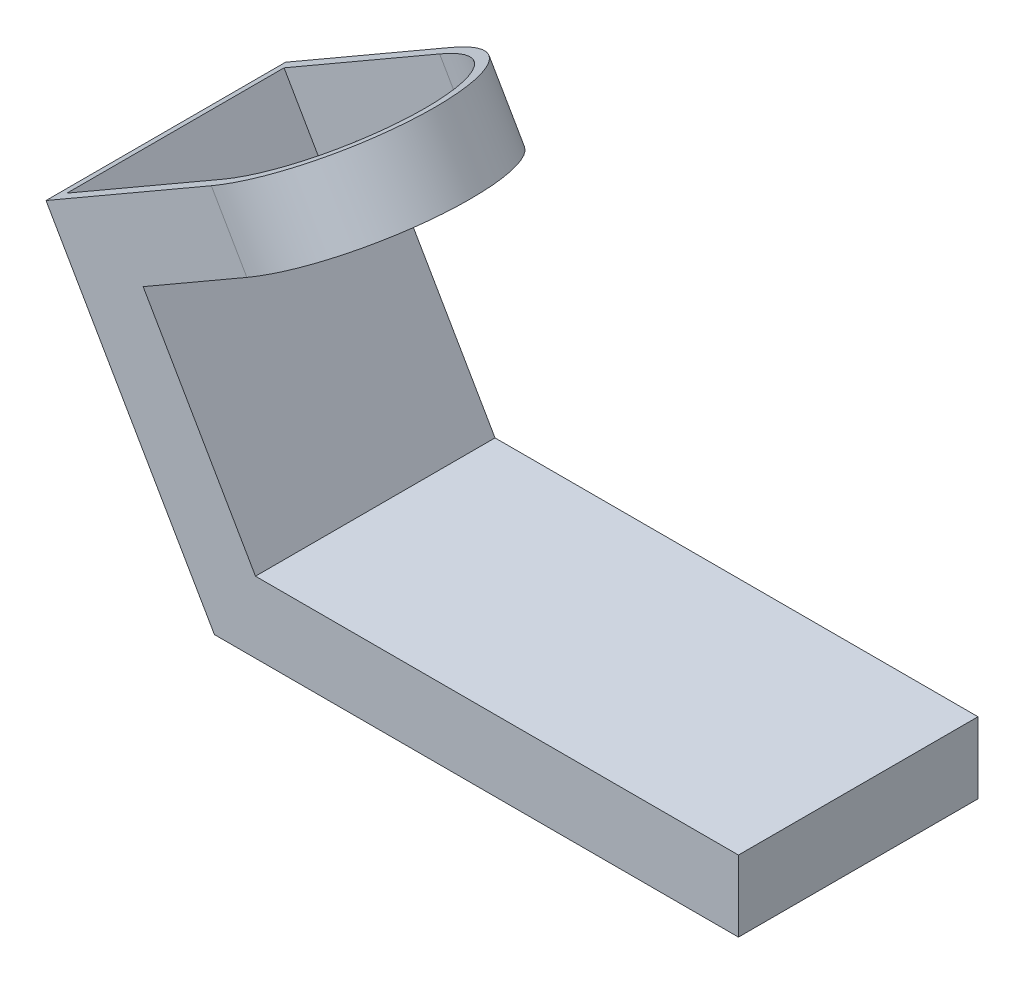
ISO-10303-21;
HEADER;
FILE_DESCRIPTION(('STEP AP214'),'2;1');
FILE_NAME('part.step','',(''),(''),'','','');
FILE_SCHEMA(('AUTOMOTIVE_DESIGN { 1 0 10303 214 1 1 1 1 }'));
ENDSEC;
DATA;
#1=APPLICATION_CONTEXT('core data for automotive mechanical design processes');
#2=APPLICATION_PROTOCOL_DEFINITION('international standard','automotive_design',2000,#1);
#3=PRODUCT_CONTEXT('',#1,'mechanical');
#4=PRODUCT('Part','Part','',(#3));
#5=PRODUCT_RELATED_PRODUCT_CATEGORY('part','',(#4));
#6=PRODUCT_DEFINITION_FORMATION('','',#4);
#7=PRODUCT_DEFINITION_CONTEXT('part definition',#1,'design');
#8=PRODUCT_DEFINITION('design','',#6,#7);
#9=PRODUCT_DEFINITION_SHAPE('','',#8);
#10=(LENGTH_UNIT() NAMED_UNIT(*) SI_UNIT(.MILLI.,.METRE.));
#11=(NAMED_UNIT(*) PLANE_ANGLE_UNIT() SI_UNIT($,.RADIAN.));
#12=(NAMED_UNIT(*) SI_UNIT($,.STERADIAN.) SOLID_ANGLE_UNIT());
#13=UNCERTAINTY_MEASURE_WITH_UNIT(LENGTH_MEASURE(1.E-05),#10,'distance_accuracy_value','');
#14=(GEOMETRIC_REPRESENTATION_CONTEXT(3) GLOBAL_UNCERTAINTY_ASSIGNED_CONTEXT((#13)) GLOBAL_UNIT_ASSIGNED_CONTEXT((#10,
#11,#12)) REPRESENTATION_CONTEXT('',''));
#15=CARTESIAN_POINT('',(0.,0.,0.));
#16=DIRECTION('',(0.,0.,1.));
#17=DIRECTION('',(1.,0.,0.));
#18=AXIS2_PLACEMENT_3D('',#15,#16,#17);
#19=CARTESIAN_POINT('',(-44.9999999999998,77.9422863405996,-64.));
#20=DIRECTION('',(-0.499999999999998,0.86602540378444,0.));
#21=DIRECTION('',(-0.86602540378444,-0.499999999999998,0.));
#22=AXIS2_PLACEMENT_3D('',#19,#20,#21);
#23=PLANE('',#22);
#24=DIRECTION('',(-0.86602540378444,-0.499999999999998,0.));
#25=VECTOR('',#24,1.);
#26=CARTESIAN_POINT('',(-44.9999999999998,77.9422863405996,0.));
#27=LINE('',#26,#25);
#28=CARTESIAN_POINT('',(-0.832704406993401,103.442286340599,0.));
#29=VERTEX_POINT('',#28);
#30=CARTESIAN_POINT('',(-44.9999999999998,77.9422863405996,0.));
#31=VERTEX_POINT('',#30);
#32=EDGE_CURVE('E184',#29,#31,#27,.T.);
#33=ORIENTED_EDGE('',*,*,#32,.F.);
#34=CARTESIAN_POINT('',(-0.832704406993429,103.442286340599,-32.));
#35=DIRECTION('',(-0.499999999999998,0.86602540378444,0.));
#36=DIRECTION('',(0.86602540378444,0.499999999999998,0.));
#37=AXIS2_PLACEMENT_3D('',#34,#35,#36);
#38=CIRCLE('',#37,32.);
#39=CARTESIAN_POINT('',(-0.832704406993429,103.442286340599,-64.));
#40=VERTEX_POINT('',#39);
#41=EDGE_CURVE('E209',#29,#40,#38,.T.);
#42=ORIENTED_EDGE('',*,*,#41,.T.);
#43=DIRECTION('',(-0.86602540378444,-0.499999999999998,0.));
#44=VECTOR('',#43,1.);
#45=CARTESIAN_POINT('',(-44.9999999999998,77.9422863405996,-64.));
#46=LINE('',#45,#44);
#47=CARTESIAN_POINT('',(-44.9999999999998,77.9422863405996,-64.));
#48=VERTEX_POINT('',#47);
#49=EDGE_CURVE('E155',#40,#48,#46,.T.);
#50=ORIENTED_EDGE('',*,*,#49,.T.);
#51=DIRECTION('',(0.,0.,1.));
#52=VECTOR('',#51,1.);
#53=CARTESIAN_POINT('',(-44.9999999999998,77.9422863405996,-64.));
#54=LINE('',#53,#52);
#55=EDGE_CURVE('E53',#48,#31,#54,.T.);
#56=ORIENTED_EDGE('',*,*,#55,.T.);
#57=EDGE_LOOP('',(#33,#42,#50,#56));
#58=FACE_BOUND('',#57,.T.);
#59=CARTESIAN_POINT('',(-0.832704406993418,103.442286340599,-32.));
#60=DIRECTION('',(-0.499999999999998,0.86602540378444,0.));
#61=DIRECTION('',(-0.86602540378444,-0.499999999999998,0.));
#62=AXIS2_PLACEMENT_3D('',#59,#60,#61);
#63=CIRCLE('',#62,29.);
#64=CARTESIAN_POINT('',(-0.832704406993405,103.442286340599,-2.99999999999999));
#65=VERTEX_POINT('',#64);
#66=CARTESIAN_POINT('',(-0.832704406993427,103.442286340599,-61.));
#67=VERTEX_POINT('',#66);
#68=EDGE_CURVE('E228',#65,#67,#63,.T.);
#69=ORIENTED_EDGE('',*,*,#68,.F.);
#70=DIRECTION('',(-0.86602540378444,-0.499999999999998,0.));
#71=VECTOR('',#70,1.);
#72=CARTESIAN_POINT('',(-44.9999999999998,77.9422863405996,-3.));
#73=LINE('',#72,#71);
#74=CARTESIAN_POINT('',(-42.4019237886465,79.4422863405996,-3.));
#75=VERTEX_POINT('',#74);
#76=EDGE_CURVE('E237',#65,#75,#73,.T.);
#77=ORIENTED_EDGE('',*,*,#76,.T.);
#78=DIRECTION('',(0.,0.,1.));
#79=VECTOR('',#78,1.);
#80=CARTESIAN_POINT('',(-42.4019237886465,79.4422863405996,-64.));
#81=LINE('',#80,#79);
#82=CARTESIAN_POINT('',(-42.4019237886465,79.4422863405996,-61.));
#83=VERTEX_POINT('',#82);
#84=EDGE_CURVE('E243',#83,#75,#81,.T.);
#85=ORIENTED_EDGE('',*,*,#84,.F.);
#86=DIRECTION('',(-0.86602540378444,-0.499999999999998,0.));
#87=VECTOR('',#86,1.);
#88=CARTESIAN_POINT('',(-44.9999999999998,77.9422863405996,-61.));
#89=LINE('',#88,#87);
#90=EDGE_CURVE('E229',#67,#83,#89,.T.);
#91=ORIENTED_EDGE('',*,*,#90,.F.);
#92=EDGE_LOOP('',(#69,#77,#85,#91));
#93=FACE_BOUND('',#92,.T.);
#94=ADVANCED_FACE('F43',(#58,#93),#23,.T.);
#95=CARTESIAN_POINT('',(140.,0.,-64.));
#96=DIRECTION('',(0.,-1.,0.));
#97=DIRECTION('',(0.,0.,-1.));
#98=AXIS2_PLACEMENT_3D('',#95,#96,#97);
#99=PLANE('',#98);
#100=DIRECTION('',(1.,0.,0.));
#101=VECTOR('',#100,1.);
#102=CARTESIAN_POINT('',(140.,0.,0.));
#103=LINE('',#102,#101);
#104=CARTESIAN_POINT('',(0.,0.,0.));
#105=VERTEX_POINT('',#104);
#106=CARTESIAN_POINT('',(140.,0.,0.));
#107=VERTEX_POINT('',#106);
#108=EDGE_CURVE('E162',#105,#107,#103,.T.);
#109=ORIENTED_EDGE('',*,*,#108,.F.);
#110=DIRECTION('',(0.,0.,1.));
#111=VECTOR('',#110,1.);
#112=CARTESIAN_POINT('',(0.,0.,-64.));
#113=LINE('',#112,#111);
#114=CARTESIAN_POINT('',(0.,0.,-64.));
#115=VERTEX_POINT('',#114);
#116=EDGE_CURVE('E11',#115,#105,#113,.T.);
#117=ORIENTED_EDGE('',*,*,#116,.F.);
#118=DIRECTION('',(1.,0.,0.));
#119=VECTOR('',#118,1.);
#120=CARTESIAN_POINT('',(140.,0.,-64.));
#121=LINE('',#120,#119);
#122=CARTESIAN_POINT('',(140.,0.,-64.));
#123=VERTEX_POINT('',#122);
#124=EDGE_CURVE('E191',#115,#123,#121,.T.);
#125=ORIENTED_EDGE('',*,*,#124,.T.);
#126=DIRECTION('',(0.,0.,1.));
#127=VECTOR('',#126,1.);
#128=CARTESIAN_POINT('',(140.,0.,-64.));
#129=LINE('',#128,#127);
#130=EDGE_CURVE('E47',#123,#107,#129,.T.);
#131=ORIENTED_EDGE('',*,*,#130,.T.);
#132=EDGE_LOOP('',(#109,#117,#125,#131));
#133=FACE_BOUND('',#132,.T.);
#134=ADVANCED_FACE('F45',(#133),#99,.T.);
#135=CARTESIAN_POINT('',(0.,0.,-64.));
#136=DIRECTION('',(-0.86602540378444,-0.499999999999998,0.));
#137=DIRECTION('',(0.499999999999998,-0.86602540378444,0.));
#138=AXIS2_PLACEMENT_3D('',#135,#136,#137);
#139=PLANE('',#138);
#140=DIRECTION('',(0.499999999999998,-0.86602540378444,0.));
#141=VECTOR('',#140,1.);
#142=CARTESIAN_POINT('',(0.,0.,0.));
#143=LINE('',#142,#141);
#144=EDGE_CURVE('E188',#31,#105,#143,.T.);
#145=ORIENTED_EDGE('',*,*,#144,.F.);
#146=ORIENTED_EDGE('',*,*,#55,.F.);
#147=DIRECTION('',(0.499999999999998,-0.86602540378444,0.));
#148=VECTOR('',#147,1.);
#149=CARTESIAN_POINT('',(0.,0.,-64.));
#150=LINE('',#149,#148);
#151=EDGE_CURVE('E159',#48,#115,#150,.T.);
#152=ORIENTED_EDGE('',*,*,#151,.T.);
#153=ORIENTED_EDGE('',*,*,#116,.T.);
#154=EDGE_LOOP('',(#145,#146,#152,#153));
#155=FACE_BOUND('',#154,.T.);
#156=ADVANCED_FACE('F204',(#155),#139,.T.);
#157=CARTESIAN_POINT('',(8.66729559300655,86.9878036686951,-64.));
#158=DIRECTION('',(0.499999999999998,-0.86602540378444,0.));
#159=DIRECTION('',(0.86602540378444,0.499999999999998,0.));
#160=AXIS2_PLACEMENT_3D('',#157,#158,#159);
#161=PLANE('',#160);
#162=CARTESIAN_POINT('',(8.66729559300654,86.9878036686951,-32.));
#163=DIRECTION('',(0.499999999999998,-0.86602540378444,0.));
#164=DIRECTION('',(0.86602540378444,0.499999999999998,0.));
#165=AXIS2_PLACEMENT_3D('',#162,#163,#164);
#166=CIRCLE('',#165,9.5);
#167=CARTESIAN_POINT('',(16.8945369289587,91.7378036686951,-32.));
#168=VERTEX_POINT('',#167);
#169=EDGE_CURVE('E216',#168,#168,#166,.F.);
#170=ORIENTED_EDGE('',*,*,#169,.T.);
#171=EDGE_LOOP('',(#170));
#172=FACE_BOUND('',#171,.T.);
#173=DIRECTION('',(0.86602540378444,0.499999999999998,0.));
#174=VECTOR('',#173,1.);
#175=CARTESIAN_POINT('',(8.66729559300655,86.9878036686951,0.));
#176=LINE('',#175,#174);
#177=CARTESIAN_POINT('',(-19.0455173280955,70.9878036686952,0.));
#178=VERTEX_POINT('',#177);
#179=CARTESIAN_POINT('',(8.66729559300654,86.9878036686952,0.));
#180=VERTEX_POINT('',#179);
#181=EDGE_CURVE('E124',#178,#180,#176,.T.);
#182=ORIENTED_EDGE('',*,*,#181,.F.);
#183=DIRECTION('',(0.,0.,1.));
#184=VECTOR('',#183,1.);
#185=CARTESIAN_POINT('',(-19.0455173280955,70.9878036686952,-64.));
#186=LINE('',#185,#184);
#187=CARTESIAN_POINT('',(-19.0455173280955,70.9878036686952,-64.));
#188=VERTEX_POINT('',#187);
#189=EDGE_CURVE('E117',#188,#178,#186,.T.);
#190=ORIENTED_EDGE('',*,*,#189,.F.);
#191=DIRECTION('',(0.86602540378444,0.499999999999998,0.));
#192=VECTOR('',#191,1.);
#193=CARTESIAN_POINT('',(8.66729559300655,86.9878036686951,-64.));
#194=LINE('',#193,#192);
#195=CARTESIAN_POINT('',(8.66729559300653,86.9878036686951,-64.));
#196=VERTEX_POINT('',#195);
#197=EDGE_CURVE('E122',#188,#196,#194,.T.);
#198=ORIENTED_EDGE('',*,*,#197,.T.);
#199=CARTESIAN_POINT('',(8.66729559300653,86.9878036686951,-32.));
#200=DIRECTION('',(-0.499999999999998,0.86602540378444,0.));
#201=DIRECTION('',(0.86602540378444,0.499999999999998,0.));
#202=AXIS2_PLACEMENT_3D('',#199,#200,#201);
#203=CIRCLE('',#202,32.);
#204=EDGE_CURVE('E167',#180,#196,#203,.T.);
#205=ORIENTED_EDGE('',*,*,#204,.F.);
#206=EDGE_LOOP('',(#182,#190,#198,#205));
#207=FACE_BOUND('',#206,.T.);
#208=ADVANCED_FACE('F119',(#172,#207),#161,.T.);
#209=CARTESIAN_POINT('',(-19.0455173280955,70.9878036686952,-64.));
#210=DIRECTION('',(0.86602540378444,0.499999999999998,0.));
#211=DIRECTION('',(-0.499999999999998,0.86602540378444,0.));
#212=AXIS2_PLACEMENT_3D('',#209,#210,#211);
#213=PLANE('',#212);
#214=DIRECTION('',(-0.499999999999998,0.86602540378444,0.));
#215=VECTOR('',#214,1.);
#216=CARTESIAN_POINT('',(-19.0455173280955,70.9878036686952,0.));
#217=LINE('',#216,#215);
#218=CARTESIAN_POINT('',(10.9696551146029,19.,0.));
#219=VERTEX_POINT('',#218);
#220=EDGE_CURVE('E175',#219,#178,#217,.T.);
#221=ORIENTED_EDGE('',*,*,#220,.F.);
#222=DIRECTION('',(0.,0.,1.));
#223=VECTOR('',#222,1.);
#224=CARTESIAN_POINT('',(10.9696551146029,19.,-64.));
#225=LINE('',#224,#223);
#226=CARTESIAN_POINT('',(10.9696551146029,19.,-64.));
#227=VERTEX_POINT('',#226);
#228=EDGE_CURVE('E130',#227,#219,#225,.T.);
#229=ORIENTED_EDGE('',*,*,#228,.F.);
#230=DIRECTION('',(-0.499999999999998,0.86602540378444,0.));
#231=VECTOR('',#230,1.);
#232=CARTESIAN_POINT('',(-19.0455173280955,70.9878036686952,-64.));
#233=LINE('',#232,#231);
#234=EDGE_CURVE('E137',#227,#188,#233,.T.);
#235=ORIENTED_EDGE('',*,*,#234,.T.);
#236=ORIENTED_EDGE('',*,*,#189,.T.);
#237=EDGE_LOOP('',(#221,#229,#235,#236));
#238=FACE_BOUND('',#237,.T.);
#239=ADVANCED_FACE('F144',(#238),#213,.T.);
#240=CARTESIAN_POINT('',(10.9696551146029,19.,-64.));
#241=DIRECTION('',(0.,1.,0.));
#242=DIRECTION('',(0.,0.,1.));
#243=AXIS2_PLACEMENT_3D('',#240,#241,#242);
#244=PLANE('',#243);
#245=DIRECTION('',(-1.,0.,0.));
#246=VECTOR('',#245,1.);
#247=CARTESIAN_POINT('',(10.9696551146029,19.,0.));
#248=LINE('',#247,#246);
#249=CARTESIAN_POINT('',(140.,19.,0.));
#250=VERTEX_POINT('',#249);
#251=EDGE_CURVE('E171',#250,#219,#248,.T.);
#252=ORIENTED_EDGE('',*,*,#251,.F.);
#253=DIRECTION('',(0.,0.,1.));
#254=VECTOR('',#253,1.);
#255=CARTESIAN_POINT('',(140.,19.,-64.));
#256=LINE('',#255,#254);
#257=CARTESIAN_POINT('',(140.,19.,-64.));
#258=VERTEX_POINT('',#257);
#259=EDGE_CURVE('E196',#258,#250,#256,.T.);
#260=ORIENTED_EDGE('',*,*,#259,.F.);
#261=DIRECTION('',(-1.,0.,0.));
#262=VECTOR('',#261,1.);
#263=CARTESIAN_POINT('',(10.9696551146029,19.,-64.));
#264=LINE('',#263,#262);
#265=EDGE_CURVE('E146',#258,#227,#264,.T.);
#266=ORIENTED_EDGE('',*,*,#265,.T.);
#267=ORIENTED_EDGE('',*,*,#228,.T.);
#268=EDGE_LOOP('',(#252,#260,#266,#267));
#269=FACE_BOUND('',#268,.T.);
#270=ADVANCED_FACE('F386',(#269),#244,.T.);
#271=CARTESIAN_POINT('',(140.,19.,-64.));
#272=DIRECTION('',(1.,0.,0.));
#273=DIRECTION('',(0.,0.,-1.));
#274=AXIS2_PLACEMENT_3D('',#271,#272,#273);
#275=PLANE('',#274);
#276=DIRECTION('',(0.,1.,0.));
#277=VECTOR('',#276,1.);
#278=CARTESIAN_POINT('',(140.,19.,0.));
#279=LINE('',#278,#277);
#280=EDGE_CURVE('E166',#107,#250,#279,.T.);
#281=ORIENTED_EDGE('',*,*,#280,.F.);
#282=ORIENTED_EDGE('',*,*,#130,.F.);
#283=DIRECTION('',(0.,1.,0.));
#284=VECTOR('',#283,1.);
#285=CARTESIAN_POINT('',(140.,19.,-64.));
#286=LINE('',#285,#284);
#287=EDGE_CURVE('E149',#123,#258,#286,.T.);
#288=ORIENTED_EDGE('',*,*,#287,.T.);
#289=ORIENTED_EDGE('',*,*,#259,.T.);
#290=EDGE_LOOP('',(#281,#282,#288,#289));
#291=FACE_BOUND('',#290,.T.);
#292=ADVANCED_FACE('F200',(#291),#275,.T.);
#293=CARTESIAN_POINT('',(0.,0.,-64.));
#294=DIRECTION('',(0.,0.,1.));
#295=DIRECTION('',(1.,0.,0.));
#296=AXIS2_PLACEMENT_3D('',#293,#294,#295);
#297=PLANE('',#296);
#298=ORIENTED_EDGE('',*,*,#124,.F.);
#299=ORIENTED_EDGE('',*,*,#151,.F.);
#300=ORIENTED_EDGE('',*,*,#49,.F.);
#301=DIRECTION('',(-0.499999999999998,0.86602540378444,0.));
#302=VECTOR('',#301,1.);
#303=CARTESIAN_POINT('',(-0.832704406993401,103.442286340599,-64.));
#304=LINE('',#303,#302);
#305=EDGE_CURVE('E141',#196,#40,#304,.T.);
#306=ORIENTED_EDGE('',*,*,#305,.F.);
#307=ORIENTED_EDGE('',*,*,#197,.F.);
#308=ORIENTED_EDGE('',*,*,#234,.F.);
#309=ORIENTED_EDGE('',*,*,#265,.F.);
#310=ORIENTED_EDGE('',*,*,#287,.F.);
#311=EDGE_LOOP('',(#298,#299,#300,#306,#307,#308,#309,#310));
#312=FACE_BOUND('',#311,.T.);
#313=ADVANCED_FACE('F135',(#312),#297,.F.);
#314=CARTESIAN_POINT('',(0.,0.,0.));
#315=DIRECTION('',(0.,0.,1.));
#316=DIRECTION('',(1.,0.,0.));
#317=AXIS2_PLACEMENT_3D('',#314,#315,#316);
#318=PLANE('',#317);
#319=ORIENTED_EDGE('',*,*,#108,.T.);
#320=ORIENTED_EDGE('',*,*,#280,.T.);
#321=ORIENTED_EDGE('',*,*,#251,.T.);
#322=ORIENTED_EDGE('',*,*,#220,.T.);
#323=ORIENTED_EDGE('',*,*,#181,.T.);
#324=DIRECTION('',(-0.499999999999998,0.86602540378444,0.));
#325=VECTOR('',#324,1.);
#326=CARTESIAN_POINT('',(-0.832704406993401,103.442286340599,0.));
#327=LINE('',#326,#325);
#328=EDGE_CURVE('E180',#180,#29,#327,.T.);
#329=ORIENTED_EDGE('',*,*,#328,.T.);
#330=ORIENTED_EDGE('',*,*,#32,.T.);
#331=ORIENTED_EDGE('',*,*,#144,.T.);
#332=EDGE_LOOP('',(#319,#320,#321,#322,#323,#329,#330,#331));
#333=FACE_BOUND('',#332,.T.);
#334=ADVANCED_FACE('F202',(#333),#318,.T.);
#335=CARTESIAN_POINT('',(8.66729559300653,86.9878036686951,-32.));
#336=DIRECTION('',(-0.499999999999998,0.86602540378444,0.));
#337=DIRECTION('',(-0.86602540378444,-0.499999999999998,0.));
#338=AXIS2_PLACEMENT_3D('',#335,#336,#337);
#339=CYLINDRICAL_SURFACE('',#338,32.);
#340=ORIENTED_EDGE('',*,*,#41,.F.);
#341=ORIENTED_EDGE('',*,*,#328,.F.);
#342=ORIENTED_EDGE('',*,*,#204,.T.);
#343=ORIENTED_EDGE('',*,*,#305,.T.);
#344=EDGE_LOOP('',(#340,#341,#342,#343));
#345=FACE_BOUND('',#344,.T.);
#346=ADVANCED_FACE('F384',(#345),#339,.T.);
#347=CARTESIAN_POINT('',(79.167978605708,-35.1229612776126,-32.));
#348=DIRECTION('',(-0.499999999999998,0.86602540378444,0.));
#349=DIRECTION('',(-0.86602540378444,-0.499999999999998,0.));
#350=AXIS2_PLACEMENT_3D('',#347,#348,#349);
#351=CYLINDRICAL_SURFACE('',#350,9.5);
#352=CARTESIAN_POINT('',(7.16729559300655,89.5858798800484,-32.));
#353=DIRECTION('',(0.499999999999998,-0.86602540378444,0.));
#354=DIRECTION('',(0.86602540378444,0.499999999999998,0.));
#355=AXIS2_PLACEMENT_3D('',#352,#353,#354);
#356=CIRCLE('',#355,9.5);
#357=CARTESIAN_POINT('',(15.3945369289587,94.3358798800484,-32.));
#358=VERTEX_POINT('',#357);
#359=EDGE_CURVE('E224',#358,#358,#356,.F.);
#360=ORIENTED_EDGE('',*,*,#359,.T.);
#361=EDGE_LOOP('',(#360));
#362=FACE_BOUND('',#361,.T.);
#363=ORIENTED_EDGE('',*,*,#169,.F.);
#364=EDGE_LOOP('',(#363));
#365=FACE_BOUND('',#364,.T.);
#366=ADVANCED_FACE('F409',(#362,#365),#351,.F.);
#367=CARTESIAN_POINT('',(140.,3.,-64.));
#368=DIRECTION('',(0.,-1.,0.));
#369=DIRECTION('',(0.,0.,-1.));
#370=AXIS2_PLACEMENT_3D('',#367,#368,#369);
#371=PLANE('',#370);
#372=DIRECTION('',(1.,0.,0.));
#373=VECTOR('',#372,1.);
#374=CARTESIAN_POINT('',(0.,3.,-3.));
#375=LINE('',#374,#373);
#376=CARTESIAN_POINT('',(1.73205080756888,3.,-3.));
#377=VERTEX_POINT('',#376);
#378=CARTESIAN_POINT('',(137.,3.,-3.));
#379=VERTEX_POINT('',#378);
#380=EDGE_CURVE('E256',#377,#379,#375,.T.);
#381=ORIENTED_EDGE('',*,*,#380,.T.);
#382=DIRECTION('',(0.,0.,1.));
#383=VECTOR('',#382,1.);
#384=CARTESIAN_POINT('',(137.,3.,-64.));
#385=LINE('',#384,#383);
#386=CARTESIAN_POINT('',(137.,3.,-61.));
#387=VERTEX_POINT('',#386);
#388=EDGE_CURVE('E262',#387,#379,#385,.T.);
#389=ORIENTED_EDGE('',*,*,#388,.F.);
#390=DIRECTION('',(1.,0.,0.));
#391=VECTOR('',#390,1.);
#392=CARTESIAN_POINT('',(0.,3.,-61.));
#393=LINE('',#392,#391);
#394=CARTESIAN_POINT('',(1.73205080756888,3.,-61.));
#395=VERTEX_POINT('',#394);
#396=EDGE_CURVE('E287',#395,#387,#393,.T.);
#397=ORIENTED_EDGE('',*,*,#396,.F.);
#398=DIRECTION('',(0.,0.,1.));
#399=VECTOR('',#398,1.);
#400=CARTESIAN_POINT('',(1.73205080756888,3.,-64.));
#401=LINE('',#400,#399);
#402=EDGE_CURVE('E223',#395,#377,#401,.T.);
#403=ORIENTED_EDGE('',*,*,#402,.T.);
#404=EDGE_LOOP('',(#381,#389,#397,#403));
#405=FACE_BOUND('',#404,.T.);
#406=ADVANCED_FACE('F322',(#405),#371,.F.);
#407=CARTESIAN_POINT('',(2.59807621135332,1.49999999999999,-64.));
#408=DIRECTION('',(-0.86602540378444,-0.499999999999998,0.));
#409=DIRECTION('',(0.499999999999998,-0.86602540378444,0.));
#410=AXIS2_PLACEMENT_3D('',#407,#408,#409);
#411=PLANE('',#410);
#412=DIRECTION('',(0.499999999999998,-0.86602540378444,0.));
#413=VECTOR('',#412,1.);
#414=CARTESIAN_POINT('',(2.59807621135332,1.49999999999999,-3.));
#415=LINE('',#414,#413);
#416=EDGE_CURVE('E241',#75,#377,#415,.T.);
#417=ORIENTED_EDGE('',*,*,#416,.T.);
#418=ORIENTED_EDGE('',*,*,#402,.F.);
#419=DIRECTION('',(0.499999999999998,-0.86602540378444,0.));
#420=VECTOR('',#419,1.);
#421=CARTESIAN_POINT('',(2.59807621135332,1.49999999999999,-61.));
#422=LINE('',#421,#420);
#423=EDGE_CURVE('E61',#83,#395,#422,.T.);
#424=ORIENTED_EDGE('',*,*,#423,.F.);
#425=ORIENTED_EDGE('',*,*,#84,.T.);
#426=EDGE_LOOP('',(#417,#418,#424,#425));
#427=FACE_BOUND('',#426,.T.);
#428=ADVANCED_FACE('F338',(#427),#411,.F.);
#429=CARTESIAN_POINT('',(7.16729559300656,89.5858798800484,-64.));
#430=DIRECTION('',(0.499999999999998,-0.86602540378444,0.));
#431=DIRECTION('',(0.86602540378444,0.499999999999998,0.));
#432=AXIS2_PLACEMENT_3D('',#429,#430,#431);
#433=PLANE('',#432);
#434=ORIENTED_EDGE('',*,*,#359,.F.);
#435=EDGE_LOOP('',(#434));
#436=FACE_BOUND('',#435,.T.);
#437=DIRECTION('',(0.86602540378444,0.499999999999998,0.));
#438=VECTOR('',#437,1.);
#439=CARTESIAN_POINT('',(-36.9999999999999,64.0858798800486,-3.));
#440=LINE('',#439,#438);
#441=CARTESIAN_POINT('',(-23.1435935394488,72.0858798800485,-3.));
#442=VERTEX_POINT('',#441);
#443=CARTESIAN_POINT('',(7.16729559300656,89.5858798800484,-2.99999999999999));
#444=VERTEX_POINT('',#443);
#445=EDGE_CURVE('E250',#442,#444,#440,.T.);
#446=ORIENTED_EDGE('',*,*,#445,.T.);
#447=CARTESIAN_POINT('',(7.16729559300655,89.5858798800484,-32.));
#448=DIRECTION('',(0.499999999999998,-0.86602540378444,0.));
#449=DIRECTION('',(0.86602540378444,0.499999999999998,0.));
#450=AXIS2_PLACEMENT_3D('',#447,#448,#449);
#451=CIRCLE('',#450,29.);
#452=CARTESIAN_POINT('',(7.16729559300657,89.5858798800485,-61.));
#453=VERTEX_POINT('',#452);
#454=EDGE_CURVE('E236',#444,#453,#451,.F.);
#455=ORIENTED_EDGE('',*,*,#454,.T.);
#456=DIRECTION('',(0.86602540378444,0.499999999999998,0.));
#457=VECTOR('',#456,1.);
#458=CARTESIAN_POINT('',(-36.9999999999999,64.0858798800486,-61.));
#459=LINE('',#458,#457);
#460=CARTESIAN_POINT('',(-23.1435935394488,72.0858798800485,-61.));
#461=VERTEX_POINT('',#460);
#462=EDGE_CURVE('E295',#461,#453,#459,.T.);
#463=ORIENTED_EDGE('',*,*,#462,.F.);
#464=DIRECTION('',(0.,0.,1.));
#465=VECTOR('',#464,1.);
#466=CARTESIAN_POINT('',(-23.1435935394488,72.0858798800485,-64.));
#467=LINE('',#466,#465);
#468=EDGE_CURVE('E246',#461,#442,#467,.T.);
#469=ORIENTED_EDGE('',*,*,#468,.T.);
#470=EDGE_LOOP('',(#446,#455,#463,#469));
#471=FACE_BOUND('',#470,.T.);
#472=ADVANCED_FACE('F358',(#436,#471),#433,.F.);
#473=CARTESIAN_POINT('',(-21.6435935394488,69.4878036686952,-64.));
#474=DIRECTION('',(0.86602540378444,0.499999999999998,0.));
#475=DIRECTION('',(-0.499999999999998,0.86602540378444,0.));
#476=AXIS2_PLACEMENT_3D('',#473,#474,#475);
#477=PLANE('',#476);
#478=DIRECTION('',(-0.499999999999998,0.86602540378444,0.));
#479=VECTOR('',#478,1.);
#480=CARTESIAN_POINT('',(13.8564064605511,7.99999999999998,-3.));
#481=LINE('',#480,#479);
#482=CARTESIAN_POINT('',(9.23760430703405,16.,-3.));
#483=VERTEX_POINT('',#482);
#484=EDGE_CURVE('E266',#483,#442,#481,.T.);
#485=ORIENTED_EDGE('',*,*,#484,.T.);
#486=ORIENTED_EDGE('',*,*,#468,.F.);
#487=DIRECTION('',(-0.499999999999998,0.86602540378444,0.));
#488=VECTOR('',#487,1.);
#489=CARTESIAN_POINT('',(13.8564064605511,7.99999999999998,-61.));
#490=LINE('',#489,#488);
#491=CARTESIAN_POINT('',(9.23760430703405,16.,-61.));
#492=VERTEX_POINT('',#491);
#493=EDGE_CURVE('E291',#492,#461,#490,.T.);
#494=ORIENTED_EDGE('',*,*,#493,.F.);
#495=DIRECTION('',(0.,0.,1.));
#496=VECTOR('',#495,1.);
#497=CARTESIAN_POINT('',(9.23760430703405,16.,-64.));
#498=LINE('',#497,#496);
#499=EDGE_CURVE('E261',#492,#483,#498,.T.);
#500=ORIENTED_EDGE('',*,*,#499,.T.);
#501=EDGE_LOOP('',(#485,#486,#494,#500));
#502=FACE_BOUND('',#501,.T.);
#503=ADVANCED_FACE('F364',(#502),#477,.F.);
#504=CARTESIAN_POINT('',(10.9696551146029,16.,-64.));
#505=DIRECTION('',(0.,1.,0.));
#506=DIRECTION('',(0.,0.,1.));
#507=AXIS2_PLACEMENT_3D('',#504,#505,#506);
#508=PLANE('',#507);
#509=DIRECTION('',(-1.,0.,0.));
#510=VECTOR('',#509,1.);
#511=CARTESIAN_POINT('',(0.,16.,-3.));
#512=LINE('',#511,#510);
#513=CARTESIAN_POINT('',(137.,16.,-3.));
#514=VERTEX_POINT('',#513);
#515=EDGE_CURVE('E255',#514,#483,#512,.T.);
#516=ORIENTED_EDGE('',*,*,#515,.T.);
#517=ORIENTED_EDGE('',*,*,#499,.F.);
#518=DIRECTION('',(-1.,0.,0.));
#519=VECTOR('',#518,1.);
#520=CARTESIAN_POINT('',(0.,16.,-61.));
#521=LINE('',#520,#519);
#522=CARTESIAN_POINT('',(137.,16.,-61.));
#523=VERTEX_POINT('',#522);
#524=EDGE_CURVE('E286',#523,#492,#521,.T.);
#525=ORIENTED_EDGE('',*,*,#524,.F.);
#526=DIRECTION('',(0.,0.,1.));
#527=VECTOR('',#526,1.);
#528=CARTESIAN_POINT('',(137.,16.,-64.));
#529=LINE('',#528,#527);
#530=EDGE_CURVE('E257',#523,#514,#529,.T.);
#531=ORIENTED_EDGE('',*,*,#530,.T.);
#532=EDGE_LOOP('',(#516,#517,#525,#531));
#533=FACE_BOUND('',#532,.T.);
#534=ADVANCED_FACE('F372',(#533),#508,.F.);
#535=CARTESIAN_POINT('',(137.,19.,-64.));
#536=DIRECTION('',(1.,0.,0.));
#537=DIRECTION('',(0.,0.,-1.));
#538=AXIS2_PLACEMENT_3D('',#535,#536,#537);
#539=PLANE('',#538);
#540=DIRECTION('',(0.,1.,0.));
#541=VECTOR('',#540,1.);
#542=CARTESIAN_POINT('',(137.,0.,-3.));
#543=LINE('',#542,#541);
#544=EDGE_CURVE('E251',#379,#514,#543,.T.);
#545=ORIENTED_EDGE('',*,*,#544,.T.);
#546=ORIENTED_EDGE('',*,*,#530,.F.);
#547=DIRECTION('',(0.,1.,0.));
#548=VECTOR('',#547,1.);
#549=CARTESIAN_POINT('',(137.,0.,-61.));
#550=LINE('',#549,#548);
#551=EDGE_CURVE('E282',#387,#523,#550,.T.);
#552=ORIENTED_EDGE('',*,*,#551,.F.);
#553=ORIENTED_EDGE('',*,*,#388,.T.);
#554=EDGE_LOOP('',(#545,#546,#552,#553));
#555=FACE_BOUND('',#554,.T.);
#556=ADVANCED_FACE('F492',(#555),#539,.F.);
#557=CARTESIAN_POINT('',(0.,0.,-61.));
#558=DIRECTION('',(0.,0.,1.));
#559=DIRECTION('',(1.,0.,0.));
#560=AXIS2_PLACEMENT_3D('',#557,#558,#559);
#561=PLANE('',#560);
#562=ORIENTED_EDGE('',*,*,#396,.T.);
#563=ORIENTED_EDGE('',*,*,#551,.T.);
#564=ORIENTED_EDGE('',*,*,#524,.T.);
#565=ORIENTED_EDGE('',*,*,#493,.T.);
#566=ORIENTED_EDGE('',*,*,#462,.T.);
#567=DIRECTION('',(-0.499999999999998,0.86602540378444,0.));
#568=VECTOR('',#567,1.);
#569=CARTESIAN_POINT('',(8.66729559300656,86.9878036686952,-61.));
#570=LINE('',#569,#568);
#571=EDGE_CURVE('E232',#453,#67,#570,.T.);
#572=ORIENTED_EDGE('',*,*,#571,.T.);
#573=ORIENTED_EDGE('',*,*,#90,.T.);
#574=ORIENTED_EDGE('',*,*,#423,.T.);
#575=EDGE_LOOP('',(#562,#563,#564,#565,#566,#572,#573,#574));
#576=FACE_BOUND('',#575,.T.);
#577=ADVANCED_FACE('F502',(#576),#561,.T.);
#578=CARTESIAN_POINT('',(0.,0.,-3.));
#579=DIRECTION('',(0.,0.,1.));
#580=DIRECTION('',(1.,0.,0.));
#581=AXIS2_PLACEMENT_3D('',#578,#579,#580);
#582=PLANE('',#581);
#583=ORIENTED_EDGE('',*,*,#380,.F.);
#584=ORIENTED_EDGE('',*,*,#416,.F.);
#585=ORIENTED_EDGE('',*,*,#76,.F.);
#586=DIRECTION('',(-0.499999999999998,0.86602540378444,0.));
#587=VECTOR('',#586,1.);
#588=CARTESIAN_POINT('',(8.66729559300655,86.9878036686952,-2.99999999999999));
#589=LINE('',#588,#587);
#590=EDGE_CURVE('E242',#444,#65,#589,.T.);
#591=ORIENTED_EDGE('',*,*,#590,.F.);
#592=ORIENTED_EDGE('',*,*,#445,.F.);
#593=ORIENTED_EDGE('',*,*,#484,.F.);
#594=ORIENTED_EDGE('',*,*,#515,.F.);
#595=ORIENTED_EDGE('',*,*,#544,.F.);
#596=EDGE_LOOP('',(#583,#584,#585,#591,#592,#593,#594,#595));
#597=FACE_BOUND('',#596,.T.);
#598=ADVANCED_FACE('F333',(#597),#582,.F.);
#599=CARTESIAN_POINT('',(8.66729559300653,86.9878036686951,-32.));
#600=DIRECTION('',(-0.499999999999998,0.86602540378444,0.));
#601=DIRECTION('',(-0.86602540378444,-0.499999999999998,0.));
#602=AXIS2_PLACEMENT_3D('',#599,#600,#601);
#603=CYLINDRICAL_SURFACE('',#602,29.);
#604=ORIENTED_EDGE('',*,*,#68,.T.);
#605=ORIENTED_EDGE('',*,*,#571,.F.);
#606=ORIENTED_EDGE('',*,*,#454,.F.);
#607=ORIENTED_EDGE('',*,*,#590,.T.);
#608=EDGE_LOOP('',(#604,#605,#606,#607));
#609=FACE_BOUND('',#608,.T.);
#610=ADVANCED_FACE('F352',(#609),#603,.F.);
#611=CLOSED_SHELL('',(#94,#134,#156,#208,#239,#270,#292,#313,#334,#346,#366,#406,#428,#472,#503,
#534,#556,#577,#598,#610));
#612=MANIFOLD_SOLID_BREP('B2',#611);
#613=ADVANCED_BREP_SHAPE_REPRESENTATION('',(#18,#612),#14);
#614=SHAPE_DEFINITION_REPRESENTATION(#9,#613);
ENDSEC;
END-ISO-10303-21;
